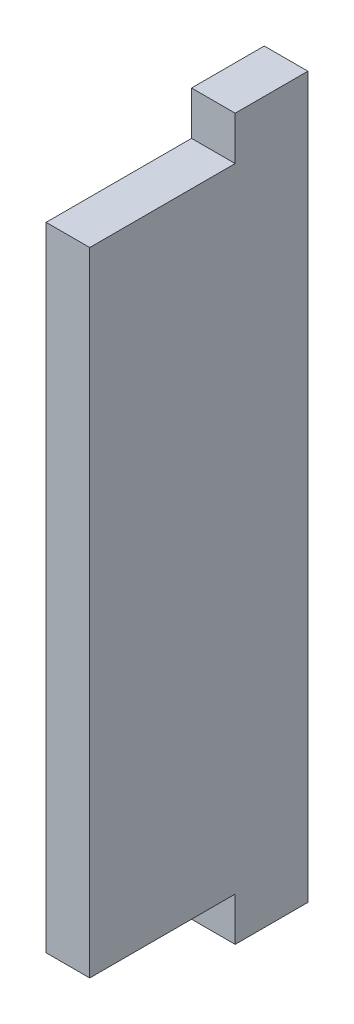
ISO-10303-21;
HEADER;
FILE_DESCRIPTION(('STEP AP214'),'2;1');
FILE_NAME('part.step','',(''),(''),'','','');
FILE_SCHEMA(('AUTOMOTIVE_DESIGN { 1 0 10303 214 1 1 1 1 }'));
ENDSEC;
DATA;
#1=APPLICATION_CONTEXT('core data for automotive mechanical design processes');
#2=APPLICATION_PROTOCOL_DEFINITION('international standard','automotive_design',2000,#1);
#3=PRODUCT_CONTEXT('',#1,'mechanical');
#4=PRODUCT('Part','Part','',(#3));
#5=PRODUCT_RELATED_PRODUCT_CATEGORY('part','',(#4));
#6=PRODUCT_DEFINITION_FORMATION('','',#4);
#7=PRODUCT_DEFINITION_CONTEXT('part definition',#1,'design');
#8=PRODUCT_DEFINITION('design','',#6,#7);
#9=PRODUCT_DEFINITION_SHAPE('','',#8);
#10=(LENGTH_UNIT() NAMED_UNIT(*) SI_UNIT(.MILLI.,.METRE.));
#11=(NAMED_UNIT(*) PLANE_ANGLE_UNIT() SI_UNIT($,.RADIAN.));
#12=(NAMED_UNIT(*) SI_UNIT($,.STERADIAN.) SOLID_ANGLE_UNIT());
#13=UNCERTAINTY_MEASURE_WITH_UNIT(LENGTH_MEASURE(1.E-05),#10,'distance_accuracy_value','');
#14=(GEOMETRIC_REPRESENTATION_CONTEXT(3) GLOBAL_UNCERTAINTY_ASSIGNED_CONTEXT((#13)) GLOBAL_UNIT_ASSIGNED_CONTEXT((#10,
#11,#12)) REPRESENTATION_CONTEXT('',''));
#15=CARTESIAN_POINT('',(0.,0.,0.));
#16=DIRECTION('',(0.,0.,1.));
#17=DIRECTION('',(1.,0.,0.));
#18=AXIS2_PLACEMENT_3D('',#15,#16,#17);
#19=CARTESIAN_POINT('',(3.,-24.75,7.5));
#20=DIRECTION('',(0.,0.,-1.));
#21=DIRECTION('',(-1.,0.,0.));
#22=AXIS2_PLACEMENT_3D('',#19,#20,#21);
#23=PLANE('',#22);
#24=DIRECTION('',(0.,-1.,0.));
#25=VECTOR('',#24,1.);
#26=CARTESIAN_POINT('',(3.,-24.75,7.5));
#27=LINE('',#26,#25);
#28=CARTESIAN_POINT('',(3.,21.75,7.5));
#29=VERTEX_POINT('',#28);
#30=CARTESIAN_POINT('',(3.,-21.75,7.5));
#31=VERTEX_POINT('',#30);
#32=EDGE_CURVE('E117',#29,#31,#27,.T.);
#33=ORIENTED_EDGE('',*,*,#32,.F.);
#34=DIRECTION('',(1.,0.,0.));
#35=VECTOR('',#34,1.);
#36=CARTESIAN_POINT('',(0.,21.75,7.5));
#37=LINE('',#36,#35);
#38=CARTESIAN_POINT('',(0.,21.75,7.5));
#39=VERTEX_POINT('',#38);
#40=EDGE_CURVE('E104',#39,#29,#37,.T.);
#41=ORIENTED_EDGE('',*,*,#40,.F.);
#42=DIRECTION('',(0.,-1.,0.));
#43=VECTOR('',#42,1.);
#44=CARTESIAN_POINT('',(0.,-24.75,7.5));
#45=LINE('',#44,#43);
#46=CARTESIAN_POINT('',(0.,-21.75,7.5));
#47=VERTEX_POINT('',#46);
#48=EDGE_CURVE('E115',#39,#47,#45,.T.);
#49=ORIENTED_EDGE('',*,*,#48,.T.);
#50=DIRECTION('',(1.,0.,0.));
#51=VECTOR('',#50,1.);
#52=CARTESIAN_POINT('',(0.,-21.75,7.5));
#53=LINE('',#52,#51);
#54=EDGE_CURVE('E153',#47,#31,#53,.T.);
#55=ORIENTED_EDGE('',*,*,#54,.T.);
#56=EDGE_LOOP('',(#33,#41,#49,#55));
#57=FACE_BOUND('',#56,.T.);
#58=ADVANCED_FACE('F37',(#57),#23,.F.);
#59=CARTESIAN_POINT('',(3.,-24.75,7.5));
#60=DIRECTION('',(0.,1.,0.));
#61=DIRECTION('',(0.,0.,1.));
#62=AXIS2_PLACEMENT_3D('',#59,#60,#61);
#63=PLANE('',#62);
#64=DIRECTION('',(0.,0.,-1.));
#65=VECTOR('',#64,1.);
#66=CARTESIAN_POINT('',(3.,-24.75,7.5));
#67=LINE('',#66,#65);
#68=CARTESIAN_POINT('',(3.,-24.75,-2.50000000000001));
#69=VERTEX_POINT('',#68);
#70=CARTESIAN_POINT('',(3.,-24.75,-7.5));
#71=VERTEX_POINT('',#70);
#72=EDGE_CURVE('E144',#69,#71,#67,.T.);
#73=ORIENTED_EDGE('',*,*,#72,.F.);
#74=DIRECTION('',(1.,0.,0.));
#75=VECTOR('',#74,1.);
#76=CARTESIAN_POINT('',(0.,-24.75,-2.50000000000001));
#77=LINE('',#76,#75);
#78=CARTESIAN_POINT('',(0.,-24.75,-2.50000000000001));
#79=VERTEX_POINT('',#78);
#80=EDGE_CURVE('E149',#79,#69,#77,.T.);
#81=ORIENTED_EDGE('',*,*,#80,.F.);
#82=DIRECTION('',(0.,0.,-1.));
#83=VECTOR('',#82,1.);
#84=CARTESIAN_POINT('',(0.,-24.75,7.5));
#85=LINE('',#84,#83);
#86=CARTESIAN_POINT('',(0.,-24.75,-7.5));
#87=VERTEX_POINT('',#86);
#88=EDGE_CURVE('E121',#79,#87,#85,.T.);
#89=ORIENTED_EDGE('',*,*,#88,.T.);
#90=DIRECTION('',(-1.,0.,0.));
#91=VECTOR('',#90,1.);
#92=CARTESIAN_POINT('',(3.,-24.75,-7.5));
#93=LINE('',#92,#91);
#94=EDGE_CURVE('E11',#71,#87,#93,.T.);
#95=ORIENTED_EDGE('',*,*,#94,.F.);
#96=EDGE_LOOP('',(#73,#81,#89,#95));
#97=FACE_BOUND('',#96,.T.);
#98=ADVANCED_FACE('F180',(#97),#63,.F.);
#99=CARTESIAN_POINT('',(3.,-24.75,-7.5));
#100=DIRECTION('',(0.,0.,1.));
#101=DIRECTION('',(1.,0.,0.));
#102=AXIS2_PLACEMENT_3D('',#99,#100,#101);
#103=PLANE('',#102);
#104=DIRECTION('',(0.,1.,0.));
#105=VECTOR('',#104,1.);
#106=CARTESIAN_POINT('',(0.,-24.75,-7.5));
#107=LINE('',#106,#105);
#108=CARTESIAN_POINT('',(0.,24.75,-7.5));
#109=VERTEX_POINT('',#108);
#110=EDGE_CURVE('E124',#87,#109,#107,.T.);
#111=ORIENTED_EDGE('',*,*,#110,.T.);
#112=DIRECTION('',(-1.,0.,0.));
#113=VECTOR('',#112,1.);
#114=CARTESIAN_POINT('',(3.,24.75,-7.5));
#115=LINE('',#114,#113);
#116=CARTESIAN_POINT('',(3.,24.75,-7.5));
#117=VERTEX_POINT('',#116);
#118=EDGE_CURVE('E44',#117,#109,#115,.T.);
#119=ORIENTED_EDGE('',*,*,#118,.F.);
#120=DIRECTION('',(0.,1.,0.));
#121=VECTOR('',#120,1.);
#122=CARTESIAN_POINT('',(3.,-24.75,-7.5));
#123=LINE('',#122,#121);
#124=EDGE_CURVE('E141',#71,#117,#123,.T.);
#125=ORIENTED_EDGE('',*,*,#124,.F.);
#126=ORIENTED_EDGE('',*,*,#94,.T.);
#127=EDGE_LOOP('',(#111,#119,#125,#126));
#128=FACE_BOUND('',#127,.T.);
#129=ADVANCED_FACE('F183',(#128),#103,.F.);
#130=CARTESIAN_POINT('',(3.,24.75,7.5));
#131=DIRECTION('',(0.,-1.,0.));
#132=DIRECTION('',(0.,0.,-1.));
#133=AXIS2_PLACEMENT_3D('',#130,#131,#132);
#134=PLANE('',#133);
#135=DIRECTION('',(0.,0.,1.));
#136=VECTOR('',#135,1.);
#137=CARTESIAN_POINT('',(0.,24.75,7.5));
#138=LINE('',#137,#136);
#139=CARTESIAN_POINT('',(0.,24.75,-2.5));
#140=VERTEX_POINT('',#139);
#141=EDGE_CURVE('E133',#109,#140,#138,.T.);
#142=ORIENTED_EDGE('',*,*,#141,.T.);
#143=DIRECTION('',(1.,0.,0.));
#144=VECTOR('',#143,1.);
#145=CARTESIAN_POINT('',(0.,24.75,-2.5));
#146=LINE('',#145,#144);
#147=CARTESIAN_POINT('',(3.,24.75,-2.5));
#148=VERTEX_POINT('',#147);
#149=EDGE_CURVE('E122',#140,#148,#146,.T.);
#150=ORIENTED_EDGE('',*,*,#149,.T.);
#151=DIRECTION('',(0.,0.,1.));
#152=VECTOR('',#151,1.);
#153=CARTESIAN_POINT('',(3.,24.75,7.5));
#154=LINE('',#153,#152);
#155=EDGE_CURVE('E129',#117,#148,#154,.T.);
#156=ORIENTED_EDGE('',*,*,#155,.F.);
#157=ORIENTED_EDGE('',*,*,#118,.T.);
#158=EDGE_LOOP('',(#142,#150,#156,#157));
#159=FACE_BOUND('',#158,.T.);
#160=ADVANCED_FACE('F168',(#159),#134,.F.);
#161=CARTESIAN_POINT('',(3.,0.,0.));
#162=DIRECTION('',(-1.,0.,0.));
#163=DIRECTION('',(0.,0.,1.));
#164=AXIS2_PLACEMENT_3D('',#161,#162,#163);
#165=PLANE('',#164);
#166=ORIENTED_EDGE('',*,*,#155,.T.);
#167=DIRECTION('',(0.,1.,0.));
#168=VECTOR('',#167,1.);
#169=CARTESIAN_POINT('',(3.,24.75,-2.5));
#170=LINE('',#169,#168);
#171=CARTESIAN_POINT('',(3.,21.75,-2.5));
#172=VERTEX_POINT('',#171);
#173=EDGE_CURVE('E109',#172,#148,#170,.T.);
#174=ORIENTED_EDGE('',*,*,#173,.F.);
#175=DIRECTION('',(0.,0.,-1.));
#176=VECTOR('',#175,1.);
#177=CARTESIAN_POINT('',(3.,21.75,7.5));
#178=LINE('',#177,#176);
#179=EDGE_CURVE('E155',#29,#172,#178,.T.);
#180=ORIENTED_EDGE('',*,*,#179,.F.);
#181=ORIENTED_EDGE('',*,*,#32,.T.);
#182=DIRECTION('',(0.,0.,1.));
#183=VECTOR('',#182,1.);
#184=CARTESIAN_POINT('',(3.,-21.75,7.5));
#185=LINE('',#184,#183);
#186=CARTESIAN_POINT('',(3.,-21.75,-2.50000000000001));
#187=VERTEX_POINT('',#186);
#188=EDGE_CURVE('E156',#187,#31,#185,.T.);
#189=ORIENTED_EDGE('',*,*,#188,.F.);
#190=DIRECTION('',(0.,1.,0.));
#191=VECTOR('',#190,1.);
#192=CARTESIAN_POINT('',(3.,-24.75,-2.50000000000001));
#193=LINE('',#192,#191);
#194=EDGE_CURVE('E159',#69,#187,#193,.T.);
#195=ORIENTED_EDGE('',*,*,#194,.F.);
#196=ORIENTED_EDGE('',*,*,#72,.T.);
#197=ORIENTED_EDGE('',*,*,#124,.T.);
#198=EDGE_LOOP('',(#166,#174,#180,#181,#189,#195,#196,#197));
#199=FACE_BOUND('',#198,.T.);
#200=ADVANCED_FACE('F170',(#199),#165,.F.);
#201=CARTESIAN_POINT('',(0.,0.,0.));
#202=DIRECTION('',(-1.,0.,0.));
#203=DIRECTION('',(0.,0.,1.));
#204=AXIS2_PLACEMENT_3D('',#201,#202,#203);
#205=PLANE('',#204);
#206=DIRECTION('',(0.,1.,0.));
#207=VECTOR('',#206,1.);
#208=CARTESIAN_POINT('',(0.,24.75,-2.5));
#209=LINE('',#208,#207);
#210=CARTESIAN_POINT('',(0.,21.75,-2.5));
#211=VERTEX_POINT('',#210);
#212=EDGE_CURVE('E51',#211,#140,#209,.T.);
#213=ORIENTED_EDGE('',*,*,#212,.T.);
#214=ORIENTED_EDGE('',*,*,#141,.F.);
#215=ORIENTED_EDGE('',*,*,#110,.F.);
#216=ORIENTED_EDGE('',*,*,#88,.F.);
#217=DIRECTION('',(0.,1.,0.));
#218=VECTOR('',#217,1.);
#219=CARTESIAN_POINT('',(0.,-24.75,-2.50000000000001));
#220=LINE('',#219,#218);
#221=CARTESIAN_POINT('',(0.,-21.75,-2.50000000000001));
#222=VERTEX_POINT('',#221);
#223=EDGE_CURVE('E158',#79,#222,#220,.T.);
#224=ORIENTED_EDGE('',*,*,#223,.T.);
#225=DIRECTION('',(0.,0.,1.));
#226=VECTOR('',#225,1.);
#227=CARTESIAN_POINT('',(0.,-21.75,7.5));
#228=LINE('',#227,#226);
#229=EDGE_CURVE('E59',#222,#47,#228,.T.);
#230=ORIENTED_EDGE('',*,*,#229,.T.);
#231=ORIENTED_EDGE('',*,*,#48,.F.);
#232=DIRECTION('',(0.,0.,-1.));
#233=VECTOR('',#232,1.);
#234=CARTESIAN_POINT('',(0.,21.75,7.5));
#235=LINE('',#234,#233);
#236=EDGE_CURVE('E100',#39,#211,#235,.T.);
#237=ORIENTED_EDGE('',*,*,#236,.T.);
#238=EDGE_LOOP('',(#213,#214,#215,#216,#224,#230,#231,#237));
#239=FACE_BOUND('',#238,.T.);
#240=ADVANCED_FACE('F119',(#239),#205,.T.);
#241=CARTESIAN_POINT('',(0.,-21.75,7.5));
#242=DIRECTION('',(0.,1.,0.));
#243=DIRECTION('',(0.,0.,1.));
#244=AXIS2_PLACEMENT_3D('',#241,#242,#243);
#245=PLANE('',#244);
#246=ORIENTED_EDGE('',*,*,#188,.T.);
#247=ORIENTED_EDGE('',*,*,#54,.F.);
#248=ORIENTED_EDGE('',*,*,#229,.F.);
#249=DIRECTION('',(1.,0.,0.));
#250=VECTOR('',#249,1.);
#251=CARTESIAN_POINT('',(0.,-21.75,-2.50000000000001));
#252=LINE('',#251,#250);
#253=EDGE_CURVE('E151',#222,#187,#252,.T.);
#254=ORIENTED_EDGE('',*,*,#253,.T.);
#255=EDGE_LOOP('',(#246,#247,#248,#254));
#256=FACE_BOUND('',#255,.T.);
#257=ADVANCED_FACE('F174',(#256),#245,.F.);
#258=CARTESIAN_POINT('',(0.,-24.75,-2.50000000000001));
#259=DIRECTION('',(0.,0.,-1.));
#260=DIRECTION('',(-1.,0.,0.));
#261=AXIS2_PLACEMENT_3D('',#258,#259,#260);
#262=PLANE('',#261);
#263=ORIENTED_EDGE('',*,*,#194,.T.);
#264=ORIENTED_EDGE('',*,*,#253,.F.);
#265=ORIENTED_EDGE('',*,*,#223,.F.);
#266=ORIENTED_EDGE('',*,*,#80,.T.);
#267=EDGE_LOOP('',(#263,#264,#265,#266));
#268=FACE_BOUND('',#267,.T.);
#269=ADVANCED_FACE('F176',(#268),#262,.F.);
#270=CARTESIAN_POINT('',(0.,24.75,-2.5));
#271=DIRECTION('',(0.,0.,-1.));
#272=DIRECTION('',(-1.,0.,0.));
#273=AXIS2_PLACEMENT_3D('',#270,#271,#272);
#274=PLANE('',#273);
#275=ORIENTED_EDGE('',*,*,#173,.T.);
#276=ORIENTED_EDGE('',*,*,#149,.F.);
#277=ORIENTED_EDGE('',*,*,#212,.F.);
#278=DIRECTION('',(1.,0.,0.));
#279=VECTOR('',#278,1.);
#280=CARTESIAN_POINT('',(0.,21.75,-2.5));
#281=LINE('',#280,#279);
#282=EDGE_CURVE('E106',#211,#172,#281,.T.);
#283=ORIENTED_EDGE('',*,*,#282,.T.);
#284=EDGE_LOOP('',(#275,#276,#277,#283));
#285=FACE_BOUND('',#284,.T.);
#286=ADVANCED_FACE('F169',(#285),#274,.F.);
#287=CARTESIAN_POINT('',(0.,21.75,7.5));
#288=DIRECTION('',(0.,-1.,0.));
#289=DIRECTION('',(0.,0.,-1.));
#290=AXIS2_PLACEMENT_3D('',#287,#288,#289);
#291=PLANE('',#290);
#292=ORIENTED_EDGE('',*,*,#179,.T.);
#293=ORIENTED_EDGE('',*,*,#282,.F.);
#294=ORIENTED_EDGE('',*,*,#236,.F.);
#295=ORIENTED_EDGE('',*,*,#40,.T.);
#296=EDGE_LOOP('',(#292,#293,#294,#295));
#297=FACE_BOUND('',#296,.T.);
#298=ADVANCED_FACE('F103',(#297),#291,.F.);
#299=CLOSED_SHELL('',(#58,#98,#129,#160,#200,#240,#257,#269,#286,#298));
#300=MANIFOLD_SOLID_BREP('B2',#299);
#301=ADVANCED_BREP_SHAPE_REPRESENTATION('',(#18,#300),#14);
#302=SHAPE_DEFINITION_REPRESENTATION(#9,#301);
ENDSEC;
END-ISO-10303-21;
